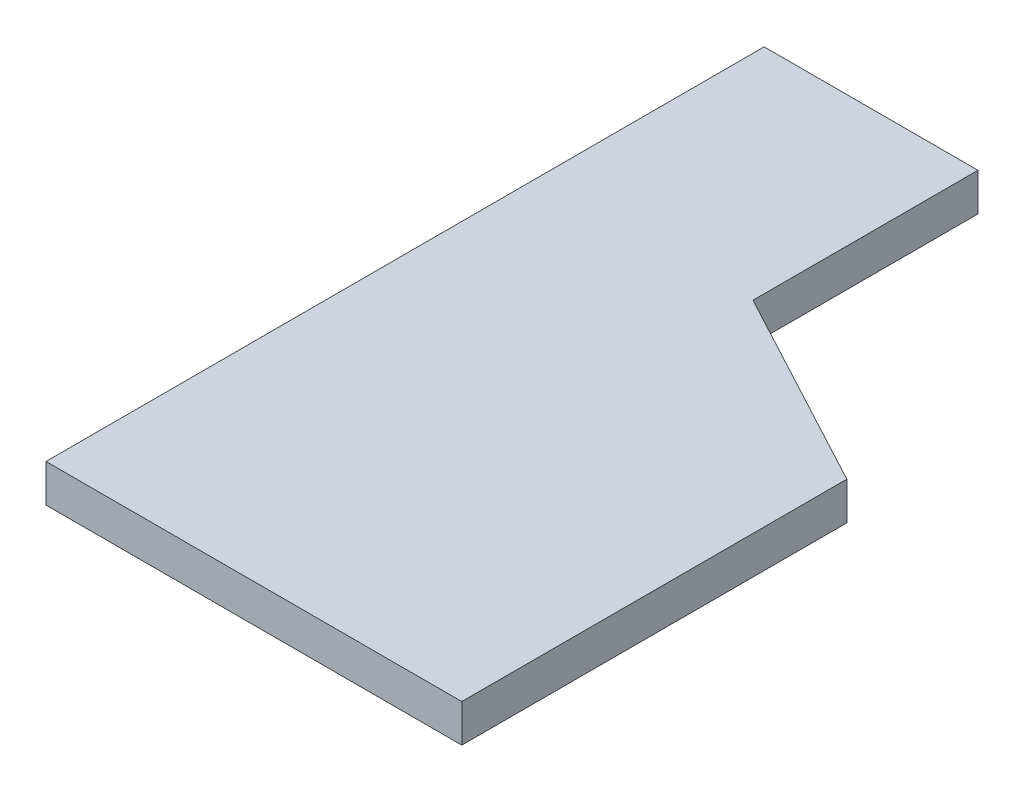
ISO-10303-21;
HEADER;
FILE_DESCRIPTION(('STEP AP214'),'2;1');
FILE_NAME('part.step','',(''),(''),'','','');
FILE_SCHEMA(('AUTOMOTIVE_DESIGN { 1 0 10303 214 1 1 1 1 }'));
ENDSEC;
DATA;
#1=APPLICATION_CONTEXT('core data for automotive mechanical design processes');
#2=APPLICATION_PROTOCOL_DEFINITION('international standard','automotive_design',2000,#1);
#3=PRODUCT_CONTEXT('',#1,'mechanical');
#4=PRODUCT('Part','Part','',(#3));
#5=PRODUCT_RELATED_PRODUCT_CATEGORY('part','',(#4));
#6=PRODUCT_DEFINITION_FORMATION('','',#4);
#7=PRODUCT_DEFINITION_CONTEXT('part definition',#1,'design');
#8=PRODUCT_DEFINITION('design','',#6,#7);
#9=PRODUCT_DEFINITION_SHAPE('','',#8);
#10=(LENGTH_UNIT() NAMED_UNIT(*) SI_UNIT(.MILLI.,.METRE.));
#11=(NAMED_UNIT(*) PLANE_ANGLE_UNIT() SI_UNIT($,.RADIAN.));
#12=(NAMED_UNIT(*) SI_UNIT($,.STERADIAN.) SOLID_ANGLE_UNIT());
#13=UNCERTAINTY_MEASURE_WITH_UNIT(LENGTH_MEASURE(1.E-05),#10,'distance_accuracy_value','');
#14=(GEOMETRIC_REPRESENTATION_CONTEXT(3) GLOBAL_UNCERTAINTY_ASSIGNED_CONTEXT((#13)) GLOBAL_UNIT_ASSIGNED_CONTEXT((#10,
#11,#12)) REPRESENTATION_CONTEXT('',''));
#15=CARTESIAN_POINT('',(0.,0.,0.));
#16=DIRECTION('',(0.,0.,1.));
#17=DIRECTION('',(1.,0.,0.));
#18=AXIS2_PLACEMENT_3D('',#15,#16,#17);
#19=CARTESIAN_POINT('',(0.,0.,120.65));
#20=DIRECTION('',(1.,0.,0.));
#21=DIRECTION('',(0.,0.,-1.));
#22=AXIS2_PLACEMENT_3D('',#19,#20,#21);
#23=PLANE('',#22);
#24=DIRECTION('',(0.,-1.,0.));
#25=VECTOR('',#24,1.);
#26=CARTESIAN_POINT('',(0.,0.,0.));
#27=LINE('',#26,#25);
#28=CARTESIAN_POINT('',(0.,6.35,0.));
#29=VERTEX_POINT('',#28);
#30=CARTESIAN_POINT('',(0.,0.,0.));
#31=VERTEX_POINT('',#30);
#32=EDGE_CURVE('E115',#29,#31,#27,.T.);
#33=ORIENTED_EDGE('',*,*,#32,.T.);
#34=DIRECTION('',(0.,0.,-1.));
#35=VECTOR('',#34,1.);
#36=CARTESIAN_POINT('',(0.,0.,120.65));
#37=LINE('',#36,#35);
#38=CARTESIAN_POINT('',(0.,0.,120.65));
#39=VERTEX_POINT('',#38);
#40=EDGE_CURVE('E11',#39,#31,#37,.T.);
#41=ORIENTED_EDGE('',*,*,#40,.F.);
#42=DIRECTION('',(0.,-1.,0.));
#43=VECTOR('',#42,1.);
#44=CARTESIAN_POINT('',(0.,0.,120.65));
#45=LINE('',#44,#43);
#46=CARTESIAN_POINT('',(0.,6.35,120.65));
#47=VERTEX_POINT('',#46);
#48=EDGE_CURVE('E118',#47,#39,#45,.T.);
#49=ORIENTED_EDGE('',*,*,#48,.F.);
#50=DIRECTION('',(0.,0.,-1.));
#51=VECTOR('',#50,1.);
#52=CARTESIAN_POINT('',(0.,6.35,120.65));
#53=LINE('',#52,#51);
#54=EDGE_CURVE('E124',#47,#29,#53,.T.);
#55=ORIENTED_EDGE('',*,*,#54,.T.);
#56=EDGE_LOOP('',(#33,#41,#49,#55));
#57=FACE_BOUND('',#56,.T.);
#58=ADVANCED_FACE('F33',(#57),#23,.F.);
#59=CARTESIAN_POINT('',(0.,0.,120.65));
#60=DIRECTION('',(0.,1.,0.));
#61=DIRECTION('',(0.,0.,1.));
#62=AXIS2_PLACEMENT_3D('',#59,#60,#61);
#63=PLANE('',#62);
#64=DIRECTION('',(0.,0.,1.));
#65=VECTOR('',#64,1.);
#66=CARTESIAN_POINT('',(35.9237495163285,0.,0.));
#67=LINE('',#66,#65);
#68=CARTESIAN_POINT('',(35.9237495163285,0.,0.));
#69=VERTEX_POINT('',#68);
#70=CARTESIAN_POINT('',(35.9237495163285,0.,37.8029993888163));
#71=VERTEX_POINT('',#70);
#72=EDGE_CURVE('E47',#69,#71,#67,.T.);
#73=ORIENTED_EDGE('',*,*,#72,.T.);
#74=DIRECTION('',(0.881647578116219,0.,0.471908410607191));
#75=VECTOR('',#74,1.);
#76=CARTESIAN_POINT('',(35.9237495163285,0.,37.8029993888163));
#77=LINE('',#76,#75);
#78=CARTESIAN_POINT('',(69.85,0.,55.9622767928545));
#79=VERTEX_POINT('',#78);
#80=EDGE_CURVE('E102',#71,#79,#77,.T.);
#81=ORIENTED_EDGE('',*,*,#80,.T.);
#82=DIRECTION('',(0.,0.,-1.));
#83=VECTOR('',#82,1.);
#84=CARTESIAN_POINT('',(69.85,0.,120.65));
#85=LINE('',#84,#83);
#86=CARTESIAN_POINT('',(69.85,0.,120.65));
#87=VERTEX_POINT('',#86);
#88=EDGE_CURVE('E40',#87,#79,#85,.T.);
#89=ORIENTED_EDGE('',*,*,#88,.F.);
#90=DIRECTION('',(1.,0.,0.));
#91=VECTOR('',#90,1.);
#92=CARTESIAN_POINT('',(0.,0.,120.65));
#93=LINE('',#92,#91);
#94=EDGE_CURVE('E78',#39,#87,#93,.T.);
#95=ORIENTED_EDGE('',*,*,#94,.F.);
#96=ORIENTED_EDGE('',*,*,#40,.T.);
#97=DIRECTION('',(1.,0.,0.));
#98=VECTOR('',#97,1.);
#99=CARTESIAN_POINT('',(0.,0.,0.));
#100=LINE('',#99,#98);
#101=EDGE_CURVE('E109',#31,#69,#100,.T.);
#102=ORIENTED_EDGE('',*,*,#101,.T.);
#103=EDGE_LOOP('',(#73,#81,#89,#95,#96,#102));
#104=FACE_BOUND('',#103,.T.);
#105=ADVANCED_FACE('F108',(#104),#63,.F.);
#106=CARTESIAN_POINT('',(69.85,0.,120.65));
#107=DIRECTION('',(-1.,0.,0.));
#108=DIRECTION('',(0.,0.,1.));
#109=AXIS2_PLACEMENT_3D('',#106,#107,#108);
#110=PLANE('',#109);
#111=ORIENTED_EDGE('',*,*,#88,.T.);
#112=DIRECTION('',(0.,1.,0.));
#113=VECTOR('',#112,1.);
#114=CARTESIAN_POINT('',(69.85,0.,55.9622767928545));
#115=LINE('',#114,#113);
#116=CARTESIAN_POINT('',(69.85,6.35,55.9622767928545));
#117=VERTEX_POINT('',#116);
#118=EDGE_CURVE('E98',#79,#117,#115,.T.);
#119=ORIENTED_EDGE('',*,*,#118,.T.);
#120=DIRECTION('',(0.,0.,-1.));
#121=VECTOR('',#120,1.);
#122=CARTESIAN_POINT('',(69.85,6.35,120.65));
#123=LINE('',#122,#121);
#124=CARTESIAN_POINT('',(69.85,6.35,120.65));
#125=VERTEX_POINT('',#124);
#126=EDGE_CURVE('E130',#125,#117,#123,.T.);
#127=ORIENTED_EDGE('',*,*,#126,.F.);
#128=DIRECTION('',(0.,1.,0.));
#129=VECTOR('',#128,1.);
#130=CARTESIAN_POINT('',(69.85,0.,120.65));
#131=LINE('',#130,#129);
#132=EDGE_CURVE('E121',#87,#125,#131,.T.);
#133=ORIENTED_EDGE('',*,*,#132,.F.);
#134=EDGE_LOOP('',(#111,#119,#127,#133));
#135=FACE_BOUND('',#134,.T.);
#136=ADVANCED_FACE('F134',(#135),#110,.F.);
#137=CARTESIAN_POINT('',(0.,6.35,120.65));
#138=DIRECTION('',(0.,-1.,0.));
#139=DIRECTION('',(0.,0.,-1.));
#140=AXIS2_PLACEMENT_3D('',#137,#138,#139);
#141=PLANE('',#140);
#142=ORIENTED_EDGE('',*,*,#126,.T.);
#143=DIRECTION('',(0.881647578116219,0.,0.471908410607191));
#144=VECTOR('',#143,1.);
#145=CARTESIAN_POINT('',(35.9237495163285,6.35,37.8029993888163));
#146=LINE('',#145,#144);
#147=CARTESIAN_POINT('',(35.9237495163285,6.35,37.8029993888163));
#148=VERTEX_POINT('',#147);
#149=EDGE_CURVE('E110',#148,#117,#146,.T.);
#150=ORIENTED_EDGE('',*,*,#149,.F.);
#151=DIRECTION('',(0.,0.,1.));
#152=VECTOR('',#151,1.);
#153=CARTESIAN_POINT('',(35.9237495163285,6.35,0.));
#154=LINE('',#153,#152);
#155=CARTESIAN_POINT('',(35.9237495163285,6.35,0.));
#156=VERTEX_POINT('',#155);
#157=EDGE_CURVE('E95',#156,#148,#154,.T.);
#158=ORIENTED_EDGE('',*,*,#157,.F.);
#159=DIRECTION('',(-1.,0.,0.));
#160=VECTOR('',#159,1.);
#161=CARTESIAN_POINT('',(0.,6.35,0.));
#162=LINE('',#161,#160);
#163=EDGE_CURVE('E71',#156,#29,#162,.T.);
#164=ORIENTED_EDGE('',*,*,#163,.T.);
#165=ORIENTED_EDGE('',*,*,#54,.F.);
#166=DIRECTION('',(-1.,0.,0.));
#167=VECTOR('',#166,1.);
#168=CARTESIAN_POINT('',(0.,6.35,120.65));
#169=LINE('',#168,#167);
#170=EDGE_CURVE('E56',#125,#47,#169,.T.);
#171=ORIENTED_EDGE('',*,*,#170,.F.);
#172=EDGE_LOOP('',(#142,#150,#158,#164,#165,#171));
#173=FACE_BOUND('',#172,.T.);
#174=ADVANCED_FACE('F143',(#173),#141,.F.);
#175=CARTESIAN_POINT('',(0.,0.,120.65));
#176=DIRECTION('',(0.,0.,-1.));
#177=DIRECTION('',(-1.,0.,0.));
#178=AXIS2_PLACEMENT_3D('',#175,#176,#177);
#179=PLANE('',#178);
#180=ORIENTED_EDGE('',*,*,#48,.T.);
#181=ORIENTED_EDGE('',*,*,#94,.T.);
#182=ORIENTED_EDGE('',*,*,#132,.T.);
#183=ORIENTED_EDGE('',*,*,#170,.T.);
#184=EDGE_LOOP('',(#180,#181,#182,#183));
#185=FACE_BOUND('',#184,.T.);
#186=ADVANCED_FACE('F136',(#185),#179,.F.);
#187=CARTESIAN_POINT('',(0.,0.,0.));
#188=DIRECTION('',(0.,0.,-1.));
#189=DIRECTION('',(-1.,0.,0.));
#190=AXIS2_PLACEMENT_3D('',#187,#188,#189);
#191=PLANE('',#190);
#192=DIRECTION('',(0.,1.,0.));
#193=VECTOR('',#192,1.);
#194=CARTESIAN_POINT('',(35.9237495163285,0.,0.));
#195=LINE('',#194,#193);
#196=EDGE_CURVE('E99',#69,#156,#195,.T.);
#197=ORIENTED_EDGE('',*,*,#196,.F.);
#198=ORIENTED_EDGE('',*,*,#101,.F.);
#199=ORIENTED_EDGE('',*,*,#32,.F.);
#200=ORIENTED_EDGE('',*,*,#163,.F.);
#201=EDGE_LOOP('',(#197,#198,#199,#200));
#202=FACE_BOUND('',#201,.T.);
#203=ADVANCED_FACE('F142',(#202),#191,.T.);
#204=CARTESIAN_POINT('',(35.9237495163285,0.,37.8029993888163));
#205=DIRECTION('',(-0.471908410607191,0.,0.881647578116219));
#206=DIRECTION('',(0.881647578116219,0.,0.471908410607191));
#207=AXIS2_PLACEMENT_3D('',#204,#205,#206);
#208=PLANE('',#207);
#209=ORIENTED_EDGE('',*,*,#149,.T.);
#210=ORIENTED_EDGE('',*,*,#118,.F.);
#211=ORIENTED_EDGE('',*,*,#80,.F.);
#212=DIRECTION('',(0.,1.,0.));
#213=VECTOR('',#212,1.);
#214=CARTESIAN_POINT('',(35.9237495163285,0.,37.8029993888163));
#215=LINE('',#214,#213);
#216=EDGE_CURVE('E92',#71,#148,#215,.T.);
#217=ORIENTED_EDGE('',*,*,#216,.T.);
#218=EDGE_LOOP('',(#209,#210,#211,#217));
#219=FACE_BOUND('',#218,.T.);
#220=ADVANCED_FACE('F103',(#219),#208,.F.);
#221=CARTESIAN_POINT('',(35.9237495163285,0.,0.));
#222=DIRECTION('',(-1.,0.,0.));
#223=DIRECTION('',(0.,0.,1.));
#224=AXIS2_PLACEMENT_3D('',#221,#222,#223);
#225=PLANE('',#224);
#226=ORIENTED_EDGE('',*,*,#157,.T.);
#227=ORIENTED_EDGE('',*,*,#216,.F.);
#228=ORIENTED_EDGE('',*,*,#72,.F.);
#229=ORIENTED_EDGE('',*,*,#196,.T.);
#230=EDGE_LOOP('',(#226,#227,#228,#229));
#231=FACE_BOUND('',#230,.T.);
#232=ADVANCED_FACE('F94',(#231),#225,.F.);
#233=CLOSED_SHELL('',(#58,#105,#136,#174,#186,#203,#220,#232));
#234=MANIFOLD_SOLID_BREP('B2',#233);
#235=ADVANCED_BREP_SHAPE_REPRESENTATION('',(#18,#234),#14);
#236=SHAPE_DEFINITION_REPRESENTATION(#9,#235);
ENDSEC;
END-ISO-10303-21;
